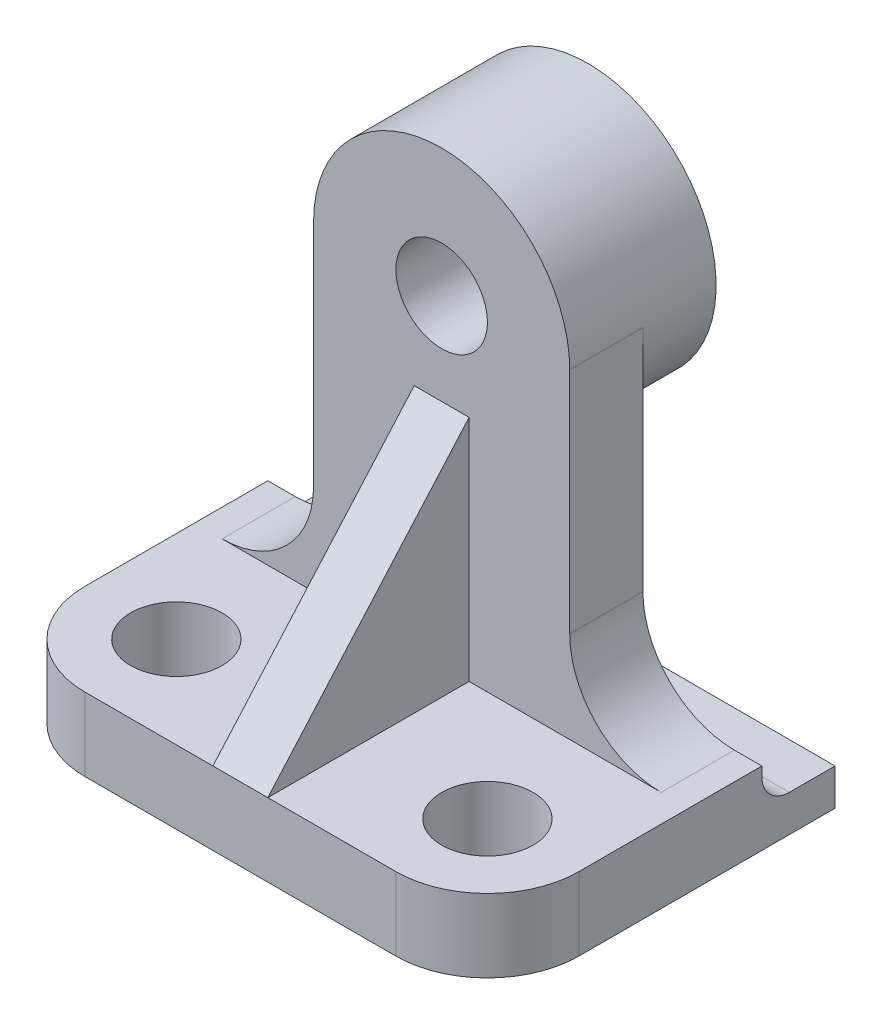
ISO-10303-21;
HEADER;
FILE_DESCRIPTION(('STEP AP214'),'2;1');
FILE_NAME('part.step','',(''),(''),'','','');
FILE_SCHEMA(('AUTOMOTIVE_DESIGN { 1 0 10303 214 1 1 1 1 }'));
ENDSEC;
DATA;
#1=APPLICATION_CONTEXT('core data for automotive mechanical design processes');
#2=APPLICATION_PROTOCOL_DEFINITION('international standard','automotive_design',2000,#1);
#3=PRODUCT_CONTEXT('',#1,'mechanical');
#4=PRODUCT('Part','Part','',(#3));
#5=PRODUCT_RELATED_PRODUCT_CATEGORY('part','',(#4));
#6=PRODUCT_DEFINITION_FORMATION('','',#4);
#7=PRODUCT_DEFINITION_CONTEXT('part definition',#1,'design');
#8=PRODUCT_DEFINITION('design','',#6,#7);
#9=PRODUCT_DEFINITION_SHAPE('','',#8);
#10=(LENGTH_UNIT() NAMED_UNIT(*) SI_UNIT(.MILLI.,.METRE.));
#11=(NAMED_UNIT(*) PLANE_ANGLE_UNIT() SI_UNIT($,.RADIAN.));
#12=(NAMED_UNIT(*) SI_UNIT($,.STERADIAN.) SOLID_ANGLE_UNIT());
#13=UNCERTAINTY_MEASURE_WITH_UNIT(LENGTH_MEASURE(1.E-05),#10,'distance_accuracy_value','');
#14=(GEOMETRIC_REPRESENTATION_CONTEXT(3) GLOBAL_UNCERTAINTY_ASSIGNED_CONTEXT((#13)) GLOBAL_UNIT_ASSIGNED_CONTEXT((#10,
#11,#12)) REPRESENTATION_CONTEXT('',''));
#15=CARTESIAN_POINT('',(0.,0.,0.));
#16=DIRECTION('',(0.,0.,1.));
#17=DIRECTION('',(1.,0.,0.));
#18=AXIS2_PLACEMENT_3D('',#15,#16,#17);
#19=CARTESIAN_POINT('',(-54.,8.,0.));
#20=DIRECTION('',(0.,1.,0.));
#21=DIRECTION('',(0.,0.,1.));
#22=AXIS2_PLACEMENT_3D('',#19,#20,#21);
#23=PLANE('',#22);
#24=CARTESIAN_POINT('',(-44.,7.99999999999999,-10.));
#25=DIRECTION('',(0.,1.,0.));
#26=DIRECTION('',(0.,0.,1.));
#27=AXIS2_PLACEMENT_3D('',#24,#25,#26);
#28=CIRCLE('',#27,5.);
#29=CARTESIAN_POINT('',(-44.,8.,-5.));
#30=VERTEX_POINT('',#29);
#31=EDGE_CURVE('E261',#30,#30,#28,.T.);
#32=ORIENTED_EDGE('',*,*,#31,.F.);
#33=EDGE_LOOP('',(#32));
#34=FACE_BOUND('',#33,.T.);
#35=DIRECTION('',(1.,0.,0.));
#36=VECTOR('',#35,1.);
#37=CARTESIAN_POINT('',(-54.,8.,0.));
#38=LINE('',#37,#36);
#39=CARTESIAN_POINT('',(-44.,8.,0.));
#40=VERTEX_POINT('',#39);
#41=CARTESIAN_POINT('',(-30.,8.,0.));
#42=VERTEX_POINT('',#41);
#43=EDGE_CURVE('E191',#40,#42,#38,.T.);
#44=ORIENTED_EDGE('',*,*,#43,.T.);
#45=DIRECTION('',(0.,0.,-1.));
#46=VECTOR('',#45,1.);
#47=CARTESIAN_POINT('',(-30.,8.,0.));
#48=LINE('',#47,#46);
#49=CARTESIAN_POINT('',(-30.,7.99999999999999,-22.));
#50=VERTEX_POINT('',#49);
#51=EDGE_CURVE('E190',#42,#50,#48,.T.);
#52=ORIENTED_EDGE('',*,*,#51,.T.);
#53=DIRECTION('',(1.,0.,0.));
#54=VECTOR('',#53,1.);
#55=CARTESIAN_POINT('',(0.,7.99999999999999,-22.));
#56=LINE('',#55,#54);
#57=CARTESIAN_POINT('',(-51.,7.99999999999999,-22.));
#58=VERTEX_POINT('',#57);
#59=EDGE_CURVE('E173',#58,#50,#56,.T.);
#60=ORIENTED_EDGE('',*,*,#59,.F.);
#61=DIRECTION('',(0.,0.,-1.));
#62=VECTOR('',#61,1.);
#63=CARTESIAN_POINT('',(-51.,8.,0.));
#64=LINE('',#63,#62);
#65=CARTESIAN_POINT('',(-51.,7.99999999999999,-30.));
#66=VERTEX_POINT('',#65);
#67=EDGE_CURVE('E373',#58,#66,#64,.T.);
#68=ORIENTED_EDGE('',*,*,#67,.T.);
#69=DIRECTION('',(1.,0.,0.));
#70=VECTOR('',#69,1.);
#71=CARTESIAN_POINT('',(-54.,7.99999999999999,-30.));
#72=LINE('',#71,#70);
#73=CARTESIAN_POINT('',(-54.,7.99999999999999,-30.));
#74=VERTEX_POINT('',#73);
#75=EDGE_CURVE('E323',#74,#66,#72,.T.);
#76=ORIENTED_EDGE('',*,*,#75,.F.);
#77=DIRECTION('',(0.,0.,1.));
#78=VECTOR('',#77,1.);
#79=CARTESIAN_POINT('',(-54.,8.,0.));
#80=LINE('',#79,#78);
#81=CARTESIAN_POINT('',(-54.,7.99999999999999,-10.));
#82=VERTEX_POINT('',#81);
#83=EDGE_CURVE('E292',#74,#82,#80,.T.);
#84=ORIENTED_EDGE('',*,*,#83,.T.);
#85=CARTESIAN_POINT('',(-44.,7.99999999999999,-10.));
#86=DIRECTION('',(0.,1.,0.));
#87=DIRECTION('',(0.,0.,1.));
#88=AXIS2_PLACEMENT_3D('',#85,#86,#87);
#89=CIRCLE('',#88,10.);
#90=EDGE_CURVE('E362',#82,#40,#89,.T.);
#91=ORIENTED_EDGE('',*,*,#90,.T.);
#92=EDGE_LOOP('',(#44,#52,#60,#68,#76,#84,#91));
#93=FACE_BOUND('',#92,.T.);
#94=ADVANCED_FACE('F47',(#34,#93),#23,.T.);
#95=CARTESIAN_POINT('',(-54.,7.99999999999999,-30.));
#96=DIRECTION('',(0.,0.,-1.));
#97=DIRECTION('',(-1.,0.,0.));
#98=AXIS2_PLACEMENT_3D('',#95,#96,#97);
#99=PLANE('',#98);
#100=DIRECTION('',(0.,1.,0.));
#101=VECTOR('',#100,1.);
#102=CARTESIAN_POINT('',(0.,7.99999999999999,-30.));
#103=LINE('',#102,#101);
#104=CARTESIAN_POINT('',(0.,7.00000000000001,-30.));
#105=VERTEX_POINT('',#104);
#106=CARTESIAN_POINT('',(0.,7.99999999999999,-30.));
#107=VERTEX_POINT('',#106);
#108=EDGE_CURVE('E312',#105,#107,#103,.T.);
#109=ORIENTED_EDGE('',*,*,#108,.F.);
#110=DIRECTION('',(1.,0.,0.));
#111=VECTOR('',#110,1.);
#112=CARTESIAN_POINT('',(-54.,7.00000000000001,-30.));
#113=LINE('',#112,#111);
#114=CARTESIAN_POINT('',(-54.,7.00000000000001,-30.));
#115=VERTEX_POINT('',#114);
#116=EDGE_CURVE('E328',#115,#105,#113,.T.);
#117=ORIENTED_EDGE('',*,*,#116,.F.);
#118=DIRECTION('',(0.,1.,0.));
#119=VECTOR('',#118,1.);
#120=CARTESIAN_POINT('',(-54.,7.99999999999999,-30.));
#121=LINE('',#120,#119);
#122=EDGE_CURVE('E288',#115,#74,#121,.T.);
#123=ORIENTED_EDGE('',*,*,#122,.T.);
#124=ORIENTED_EDGE('',*,*,#75,.T.);
#125=CARTESIAN_POINT('',(-51.,18.,-30.));
#126=DIRECTION('',(0.,0.,-1.));
#127=DIRECTION('',(-1.,0.,0.));
#128=AXIS2_PLACEMENT_3D('',#125,#126,#127);
#129=CIRCLE('',#128,10.);
#130=CARTESIAN_POINT('',(-41.,18.,-30.));
#131=VERTEX_POINT('',#130);
#132=EDGE_CURVE('E383',#66,#131,#129,.F.);
#133=ORIENTED_EDGE('',*,*,#132,.T.);
#134=DIRECTION('',(0.,-1.,0.));
#135=VECTOR('',#134,1.);
#136=CARTESIAN_POINT('',(-41.,0.,-30.));
#137=LINE('',#136,#135);
#138=CARTESIAN_POINT('',(-41.,43.,-30.));
#139=VERTEX_POINT('',#138);
#140=EDGE_CURVE('E235',#139,#131,#137,.T.);
#141=ORIENTED_EDGE('',*,*,#140,.F.);
#142=CARTESIAN_POINT('',(-27.,43.,-30.));
#143=DIRECTION('',(0.,0.,-1.));
#144=DIRECTION('',(-1.,0.,0.));
#145=AXIS2_PLACEMENT_3D('',#142,#143,#144);
#146=CIRCLE('',#145,14.);
#147=CARTESIAN_POINT('',(-13.,43.,-30.));
#148=VERTEX_POINT('',#147);
#149=EDGE_CURVE('E222',#148,#139,#146,.T.);
#150=ORIENTED_EDGE('',*,*,#149,.F.);
#151=DIRECTION('',(0.,-1.,0.));
#152=VECTOR('',#151,1.);
#153=CARTESIAN_POINT('',(-13.,0.,-30.));
#154=LINE('',#153,#152);
#155=CARTESIAN_POINT('',(-13.,18.,-30.));
#156=VERTEX_POINT('',#155);
#157=EDGE_CURVE('E227',#148,#156,#154,.T.);
#158=ORIENTED_EDGE('',*,*,#157,.T.);
#159=CARTESIAN_POINT('',(-3.,18.,-30.));
#160=DIRECTION('',(0.,0.,-1.));
#161=DIRECTION('',(-1.,0.,0.));
#162=AXIS2_PLACEMENT_3D('',#159,#160,#161);
#163=CIRCLE('',#162,10.);
#164=CARTESIAN_POINT('',(-3.,7.99999999999999,-30.));
#165=VERTEX_POINT('',#164);
#166=EDGE_CURVE('E56',#156,#165,#163,.F.);
#167=ORIENTED_EDGE('',*,*,#166,.T.);
#168=EDGE_CURVE('E327',#165,#107,#72,.T.);
#169=ORIENTED_EDGE('',*,*,#168,.T.);
#170=EDGE_LOOP('',(#109,#117,#123,#124,#133,#141,#150,#158,#167,#169));
#171=FACE_BOUND('',#170,.T.);
#172=ADVANCED_FACE('F391',(#171),#99,.T.);
#173=CARTESIAN_POINT('',(-54.,0.,0.));
#174=DIRECTION('',(0.,0.,1.));
#175=DIRECTION('',(1.,0.,0.));
#176=AXIS2_PLACEMENT_3D('',#173,#174,#175);
#177=PLANE('',#176);
#178=CARTESIAN_POINT('',(-24.,8.,0.));
#179=VERTEX_POINT('',#178);
#180=CARTESIAN_POINT('',(-10.,8.,0.));
#181=VERTEX_POINT('',#180);
#182=EDGE_CURVE('E322',#179,#181,#38,.T.);
#183=ORIENTED_EDGE('',*,*,#182,.F.);
#184=DIRECTION('',(-1.,0.,0.));
#185=VECTOR('',#184,1.);
#186=CARTESIAN_POINT('',(-54.,8.,0.));
#187=LINE('',#186,#185);
#188=EDGE_CURVE('E70',#42,#179,#187,.F.);
#189=ORIENTED_EDGE('',*,*,#188,.F.);
#190=ORIENTED_EDGE('',*,*,#43,.F.);
#191=DIRECTION('',(0.,-1.,0.));
#192=VECTOR('',#191,1.);
#193=CARTESIAN_POINT('',(-44.,0.,0.));
#194=LINE('',#193,#192);
#195=CARTESIAN_POINT('',(-44.,0.,0.));
#196=VERTEX_POINT('',#195);
#197=EDGE_CURVE('E345',#40,#196,#194,.T.);
#198=ORIENTED_EDGE('',*,*,#197,.T.);
#199=DIRECTION('',(1.,0.,0.));
#200=VECTOR('',#199,1.);
#201=CARTESIAN_POINT('',(-54.,0.,0.));
#202=LINE('',#201,#200);
#203=CARTESIAN_POINT('',(-10.,0.,0.));
#204=VERTEX_POINT('',#203);
#205=EDGE_CURVE('E296',#196,#204,#202,.T.);
#206=ORIENTED_EDGE('',*,*,#205,.T.);
#207=DIRECTION('',(0.,-1.,0.));
#208=VECTOR('',#207,1.);
#209=CARTESIAN_POINT('',(-10.,0.,0.));
#210=LINE('',#209,#208);
#211=EDGE_CURVE('E321',#204,#181,#210,.F.);
#212=ORIENTED_EDGE('',*,*,#211,.T.);
#213=EDGE_LOOP('',(#183,#189,#190,#198,#206,#212));
#214=FACE_BOUND('',#213,.T.);
#215=ADVANCED_FACE('F427',(#214),#177,.T.);
#216=DIRECTION('',(0.,0.,-1.));
#217=VECTOR('',#216,1.);
#218=CARTESIAN_POINT('',(-24.,8.,0.));
#219=LINE('',#218,#217);
#220=CARTESIAN_POINT('',(-24.,7.99999999999999,-22.));
#221=VERTEX_POINT('',#220);
#222=EDGE_CURVE('E63',#179,#221,#219,.T.);
#223=ORIENTED_EDGE('',*,*,#222,.F.);
#224=ORIENTED_EDGE('',*,*,#182,.T.);
#225=CARTESIAN_POINT('',(-10.,7.99999999999999,-10.));
#226=DIRECTION('',(0.,1.,0.));
#227=DIRECTION('',(0.,0.,1.));
#228=AXIS2_PLACEMENT_3D('',#225,#226,#227);
#229=CIRCLE('',#228,10.);
#230=CARTESIAN_POINT('',(0.,7.99999999999999,-10.));
#231=VERTEX_POINT('',#230);
#232=EDGE_CURVE('E359',#181,#231,#229,.T.);
#233=ORIENTED_EDGE('',*,*,#232,.T.);
#234=DIRECTION('',(0.,0.,1.));
#235=VECTOR('',#234,1.);
#236=CARTESIAN_POINT('',(0.,8.,0.));
#237=LINE('',#236,#235);
#238=EDGE_CURVE('E276',#107,#231,#237,.T.);
#239=ORIENTED_EDGE('',*,*,#238,.F.);
#240=ORIENTED_EDGE('',*,*,#168,.F.);
#241=DIRECTION('',(0.,0.,-1.));
#242=VECTOR('',#241,1.);
#243=CARTESIAN_POINT('',(-3.,7.99999999999999,-22.));
#244=LINE('',#243,#242);
#245=CARTESIAN_POINT('',(-3.,7.99999999999999,-22.));
#246=VERTEX_POINT('',#245);
#247=EDGE_CURVE('E369',#165,#246,#244,.F.);
#248=ORIENTED_EDGE('',*,*,#247,.T.);
#249=EDGE_CURVE('E187',#221,#246,#56,.T.);
#250=ORIENTED_EDGE('',*,*,#249,.F.);
#251=EDGE_LOOP('',(#223,#224,#233,#239,#240,#248,#250));
#252=FACE_BOUND('',#251,.T.);
#253=CARTESIAN_POINT('',(-10.,7.99999999999999,-10.));
#254=DIRECTION('',(0.,1.,0.));
#255=DIRECTION('',(0.,0.,1.));
#256=AXIS2_PLACEMENT_3D('',#253,#254,#255);
#257=CIRCLE('',#256,5.);
#258=CARTESIAN_POINT('',(-10.,8.,-5.00000000000001));
#259=VERTEX_POINT('',#258);
#260=EDGE_CURVE('E265',#259,#259,#257,.T.);
#261=ORIENTED_EDGE('',*,*,#260,.F.);
#262=EDGE_LOOP('',(#261));
#263=FACE_BOUND('',#262,.T.);
#264=ADVANCED_FACE('F397',(#252,#263),#23,.T.);
#265=CARTESIAN_POINT('',(-54.,6.99999999999999,-33.));
#266=DIRECTION('',(1.,0.,0.));
#267=DIRECTION('',(0.,0.,-1.));
#268=AXIS2_PLACEMENT_3D('',#265,#266,#267);
#269=CYLINDRICAL_SURFACE('',#268,3.);
#270=CARTESIAN_POINT('',(0.,6.99999999999999,-33.));
#271=DIRECTION('',(-1.,0.,0.));
#272=DIRECTION('',(0.,0.,-1.));
#273=AXIS2_PLACEMENT_3D('',#270,#271,#272);
#274=CIRCLE('',#273,3.);
#275=CARTESIAN_POINT('',(0.,3.99999999999999,-33.));
#276=VERTEX_POINT('',#275);
#277=EDGE_CURVE('E308',#276,#105,#274,.T.);
#278=ORIENTED_EDGE('',*,*,#277,.F.);
#279=DIRECTION('',(1.,0.,0.));
#280=VECTOR('',#279,1.);
#281=CARTESIAN_POINT('',(-54.,3.99999999999999,-33.));
#282=LINE('',#281,#280);
#283=CARTESIAN_POINT('',(-54.,3.99999999999999,-33.));
#284=VERTEX_POINT('',#283);
#285=EDGE_CURVE('E331',#284,#276,#282,.T.);
#286=ORIENTED_EDGE('',*,*,#285,.F.);
#287=CARTESIAN_POINT('',(-54.,6.99999999999999,-33.));
#288=DIRECTION('',(-1.,0.,0.));
#289=DIRECTION('',(0.,0.,-1.));
#290=AXIS2_PLACEMENT_3D('',#287,#288,#289);
#291=CIRCLE('',#290,3.);
#292=EDGE_CURVE('E284',#284,#115,#291,.T.);
#293=ORIENTED_EDGE('',*,*,#292,.T.);
#294=ORIENTED_EDGE('',*,*,#116,.T.);
#295=EDGE_LOOP('',(#278,#286,#293,#294));
#296=FACE_BOUND('',#295,.T.);
#297=ADVANCED_FACE('F469',(#296),#269,.F.);
#298=CARTESIAN_POINT('',(-54.,3.99999999999999,-33.));
#299=DIRECTION('',(0.,1.,0.));
#300=DIRECTION('',(0.,0.,1.));
#301=AXIS2_PLACEMENT_3D('',#298,#299,#300);
#302=PLANE('',#301);
#303=DIRECTION('',(0.,0.,1.));
#304=VECTOR('',#303,1.);
#305=CARTESIAN_POINT('',(0.,3.99999999999999,-33.));
#306=LINE('',#305,#304);
#307=CARTESIAN_POINT('',(0.,4.,-38.));
#308=VERTEX_POINT('',#307);
#309=EDGE_CURVE('E304',#308,#276,#306,.T.);
#310=ORIENTED_EDGE('',*,*,#309,.F.);
#311=DIRECTION('',(1.,0.,0.));
#312=VECTOR('',#311,1.);
#313=CARTESIAN_POINT('',(-54.,4.,-38.));
#314=LINE('',#313,#312);
#315=CARTESIAN_POINT('',(-54.,4.,-38.));
#316=VERTEX_POINT('',#315);
#317=EDGE_CURVE('E334',#316,#308,#314,.T.);
#318=ORIENTED_EDGE('',*,*,#317,.F.);
#319=DIRECTION('',(0.,0.,1.));
#320=VECTOR('',#319,1.);
#321=CARTESIAN_POINT('',(-54.,3.99999999999999,-33.));
#322=LINE('',#321,#320);
#323=EDGE_CURVE('E280',#316,#284,#322,.T.);
#324=ORIENTED_EDGE('',*,*,#323,.T.);
#325=ORIENTED_EDGE('',*,*,#285,.T.);
#326=EDGE_LOOP('',(#310,#318,#324,#325));
#327=FACE_BOUND('',#326,.T.);
#328=ADVANCED_FACE('F474',(#327),#302,.T.);
#329=CARTESIAN_POINT('',(-54.,0.,-38.));
#330=DIRECTION('',(0.,0.,-1.));
#331=DIRECTION('',(-1.,0.,0.));
#332=AXIS2_PLACEMENT_3D('',#329,#330,#331);
#333=PLANE('',#332);
#334=DIRECTION('',(0.,1.,0.));
#335=VECTOR('',#334,1.);
#336=CARTESIAN_POINT('',(0.,0.,-38.));
#337=LINE('',#336,#335);
#338=CARTESIAN_POINT('',(0.,0.,-38.));
#339=VERTEX_POINT('',#338);
#340=EDGE_CURVE('E300',#339,#308,#337,.T.);
#341=ORIENTED_EDGE('',*,*,#340,.F.);
#342=DIRECTION('',(1.,0.,0.));
#343=VECTOR('',#342,1.);
#344=CARTESIAN_POINT('',(-54.,0.,-38.));
#345=LINE('',#344,#343);
#346=CARTESIAN_POINT('',(-54.,0.,-38.));
#347=VERTEX_POINT('',#346);
#348=EDGE_CURVE('E337',#347,#339,#345,.T.);
#349=ORIENTED_EDGE('',*,*,#348,.F.);
#350=DIRECTION('',(0.,1.,0.));
#351=VECTOR('',#350,1.);
#352=CARTESIAN_POINT('',(-54.,0.,-38.));
#353=LINE('',#352,#351);
#354=EDGE_CURVE('E275',#347,#316,#353,.T.);
#355=ORIENTED_EDGE('',*,*,#354,.T.);
#356=ORIENTED_EDGE('',*,*,#317,.T.);
#357=EDGE_LOOP('',(#341,#349,#355,#356));
#358=FACE_BOUND('',#357,.T.);
#359=ADVANCED_FACE('F526',(#358),#333,.T.);
#360=CARTESIAN_POINT('',(-54.,0.,0.));
#361=DIRECTION('',(0.,-1.,0.));
#362=DIRECTION('',(0.,0.,-1.));
#363=AXIS2_PLACEMENT_3D('',#360,#361,#362);
#364=PLANE('',#363);
#365=CARTESIAN_POINT('',(-10.,0.,-10.));
#366=DIRECTION('',(0.,-1.,0.));
#367=DIRECTION('',(0.,0.,-1.));
#368=AXIS2_PLACEMENT_3D('',#365,#366,#367);
#369=CIRCLE('',#368,10.);
#370=CARTESIAN_POINT('',(0.,0.,-10.));
#371=VERTEX_POINT('',#370);
#372=EDGE_CURVE('E349',#371,#204,#369,.T.);
#373=ORIENTED_EDGE('',*,*,#372,.T.);
#374=ORIENTED_EDGE('',*,*,#205,.F.);
#375=CARTESIAN_POINT('',(-44.,0.,-10.));
#376=DIRECTION('',(0.,-1.,0.));
#377=DIRECTION('',(0.,0.,-1.));
#378=AXIS2_PLACEMENT_3D('',#375,#376,#377);
#379=CIRCLE('',#378,10.);
#380=CARTESIAN_POINT('',(-54.,0.,-10.));
#381=VERTEX_POINT('',#380);
#382=EDGE_CURVE('E353',#196,#381,#379,.T.);
#383=ORIENTED_EDGE('',*,*,#382,.T.);
#384=DIRECTION('',(0.,0.,-1.));
#385=VECTOR('',#384,1.);
#386=CARTESIAN_POINT('',(-54.,0.,0.));
#387=LINE('',#386,#385);
#388=EDGE_CURVE('E272',#381,#347,#387,.T.);
#389=ORIENTED_EDGE('',*,*,#388,.T.);
#390=ORIENTED_EDGE('',*,*,#348,.T.);
#391=DIRECTION('',(0.,0.,-1.));
#392=VECTOR('',#391,1.);
#393=CARTESIAN_POINT('',(0.,0.,0.));
#394=LINE('',#393,#392);
#395=EDGE_CURVE('E260',#371,#339,#394,.T.);
#396=ORIENTED_EDGE('',*,*,#395,.F.);
#397=EDGE_LOOP('',(#373,#374,#383,#389,#390,#396));
#398=FACE_BOUND('',#397,.T.);
#399=CARTESIAN_POINT('',(-10.,0.,-10.));
#400=DIRECTION('',(0.,1.,0.));
#401=DIRECTION('',(0.,0.,1.));
#402=AXIS2_PLACEMENT_3D('',#399,#400,#401);
#403=CIRCLE('',#402,5.);
#404=CARTESIAN_POINT('',(-10.,0.,-5.));
#405=VERTEX_POINT('',#404);
#406=EDGE_CURVE('E252',#405,#405,#403,.T.);
#407=ORIENTED_EDGE('',*,*,#406,.T.);
#408=EDGE_LOOP('',(#407));
#409=FACE_BOUND('',#408,.T.);
#410=CARTESIAN_POINT('',(-44.,0.,-10.));
#411=DIRECTION('',(0.,1.,0.));
#412=DIRECTION('',(0.,0.,1.));
#413=AXIS2_PLACEMENT_3D('',#410,#411,#412);
#414=CIRCLE('',#413,5.);
#415=CARTESIAN_POINT('',(-44.,0.,-5.));
#416=VERTEX_POINT('',#415);
#417=EDGE_CURVE('E256',#416,#416,#414,.T.);
#418=ORIENTED_EDGE('',*,*,#417,.T.);
#419=EDGE_LOOP('',(#418));
#420=FACE_BOUND('',#419,.T.);
#421=ADVANCED_FACE('F429',(#398,#409,#420),#364,.T.);
#422=CARTESIAN_POINT('',(-54.,6.99999999999999,-33.));
#423=DIRECTION('',(1.,0.,0.));
#424=DIRECTION('',(0.,0.,-1.));
#425=AXIS2_PLACEMENT_3D('',#422,#423,#424);
#426=PLANE('',#425);
#427=ORIENTED_EDGE('',*,*,#388,.F.);
#428=DIRECTION('',(0.,-1.,0.));
#429=VECTOR('',#428,1.);
#430=CARTESIAN_POINT('',(-54.,8.,-10.));
#431=LINE('',#430,#429);
#432=EDGE_CURVE('E356',#381,#82,#431,.F.);
#433=ORIENTED_EDGE('',*,*,#432,.T.);
#434=ORIENTED_EDGE('',*,*,#83,.F.);
#435=ORIENTED_EDGE('',*,*,#122,.F.);
#436=ORIENTED_EDGE('',*,*,#292,.F.);
#437=ORIENTED_EDGE('',*,*,#323,.F.);
#438=ORIENTED_EDGE('',*,*,#354,.F.);
#439=EDGE_LOOP('',(#427,#433,#434,#435,#436,#437,#438));
#440=FACE_BOUND('',#439,.T.);
#441=ADVANCED_FACE('F420',(#440),#426,.F.);
#442=CARTESIAN_POINT('',(0.,6.99999999999999,-33.));
#443=DIRECTION('',(1.,0.,0.));
#444=DIRECTION('',(0.,0.,-1.));
#445=AXIS2_PLACEMENT_3D('',#442,#443,#444);
#446=PLANE('',#445);
#447=ORIENTED_EDGE('',*,*,#238,.T.);
#448=DIRECTION('',(0.,-1.,0.));
#449=VECTOR('',#448,1.);
#450=CARTESIAN_POINT('',(0.,6.99999999999999,-10.));
#451=LINE('',#450,#449);
#452=EDGE_CURVE('E365',#231,#371,#451,.T.);
#453=ORIENTED_EDGE('',*,*,#452,.T.);
#454=ORIENTED_EDGE('',*,*,#395,.T.);
#455=ORIENTED_EDGE('',*,*,#340,.T.);
#456=ORIENTED_EDGE('',*,*,#309,.T.);
#457=ORIENTED_EDGE('',*,*,#277,.T.);
#458=ORIENTED_EDGE('',*,*,#108,.T.);
#459=EDGE_LOOP('',(#447,#453,#454,#455,#456,#457,#458));
#460=FACE_BOUND('',#459,.T.);
#461=ADVANCED_FACE('F485',(#460),#446,.T.);
#462=CARTESIAN_POINT('',(-44.,0.,-10.));
#463=DIRECTION('',(0.,1.,0.));
#464=DIRECTION('',(0.,0.,1.));
#465=AXIS2_PLACEMENT_3D('',#462,#463,#464);
#466=CYLINDRICAL_SURFACE('',#465,10.);
#467=ORIENTED_EDGE('',*,*,#90,.F.);
#468=ORIENTED_EDGE('',*,*,#432,.F.);
#469=ORIENTED_EDGE('',*,*,#382,.F.);
#470=ORIENTED_EDGE('',*,*,#197,.F.);
#471=EDGE_LOOP('',(#467,#468,#469,#470));
#472=FACE_BOUND('',#471,.T.);
#473=ADVANCED_FACE('F425',(#472),#466,.T.);
#474=CARTESIAN_POINT('',(-10.,6.99999999999999,-10.));
#475=DIRECTION('',(0.,-1.,0.));
#476=DIRECTION('',(0.,0.,-1.));
#477=AXIS2_PLACEMENT_3D('',#474,#475,#476);
#478=CYLINDRICAL_SURFACE('',#477,10.);
#479=ORIENTED_EDGE('',*,*,#232,.F.);
#480=ORIENTED_EDGE('',*,*,#211,.F.);
#481=ORIENTED_EDGE('',*,*,#372,.F.);
#482=ORIENTED_EDGE('',*,*,#452,.F.);
#483=EDGE_LOOP('',(#479,#480,#481,#482));
#484=FACE_BOUND('',#483,.T.);
#485=ADVANCED_FACE('F436',(#484),#478,.T.);
#486=CARTESIAN_POINT('',(-10.,0.,-10.));
#487=DIRECTION('',(0.,1.,0.));
#488=DIRECTION('',(0.,0.,1.));
#489=AXIS2_PLACEMENT_3D('',#486,#487,#488);
#490=CYLINDRICAL_SURFACE('',#489,5.);
#491=ORIENTED_EDGE('',*,*,#406,.F.);
#492=EDGE_LOOP('',(#491));
#493=FACE_BOUND('',#492,.T.);
#494=ORIENTED_EDGE('',*,*,#260,.T.);
#495=EDGE_LOOP('',(#494));
#496=FACE_BOUND('',#495,.T.);
#497=ADVANCED_FACE('F487',(#493,#496),#490,.F.);
#498=CARTESIAN_POINT('',(-44.,0.,-10.));
#499=DIRECTION('',(0.,1.,0.));
#500=DIRECTION('',(0.,0.,1.));
#501=AXIS2_PLACEMENT_3D('',#498,#499,#500);
#502=CYLINDRICAL_SURFACE('',#501,5.);
#503=ORIENTED_EDGE('',*,*,#417,.F.);
#504=EDGE_LOOP('',(#503));
#505=FACE_BOUND('',#504,.T.);
#506=ORIENTED_EDGE('',*,*,#31,.T.);
#507=EDGE_LOOP('',(#506));
#508=FACE_BOUND('',#507,.T.);
#509=ADVANCED_FACE('F507',(#505,#508),#502,.F.);
#510=CARTESIAN_POINT('',(-27.,43.,-22.));
#511=DIRECTION('',(0.,0.,-1.));
#512=DIRECTION('',(-1.,0.,0.));
#513=AXIS2_PLACEMENT_3D('',#510,#511,#512);
#514=CYLINDRICAL_SURFACE('',#513,14.);
#515=ORIENTED_EDGE('',*,*,#149,.T.);
#516=DIRECTION('',(0.,0.,-1.));
#517=VECTOR('',#516,1.);
#518=CARTESIAN_POINT('',(-41.,43.,-22.));
#519=LINE('',#518,#517);
#520=CARTESIAN_POINT('',(-41.,43.,-22.));
#521=VERTEX_POINT('',#520);
#522=EDGE_CURVE('E248',#521,#139,#519,.T.);
#523=ORIENTED_EDGE('',*,*,#522,.F.);
#524=CARTESIAN_POINT('',(-27.,43.,-22.));
#525=DIRECTION('',(0.,0.,-1.));
#526=DIRECTION('',(-1.,0.,0.));
#527=AXIS2_PLACEMENT_3D('',#524,#525,#526);
#528=CIRCLE('',#527,14.);
#529=CARTESIAN_POINT('',(-13.,43.,-22.));
#530=VERTEX_POINT('',#529);
#531=EDGE_CURVE('E230',#521,#530,#528,.T.);
#532=ORIENTED_EDGE('',*,*,#531,.T.);
#533=DIRECTION('',(0.,0.,-1.));
#534=VECTOR('',#533,1.);
#535=CARTESIAN_POINT('',(-13.,43.,-22.));
#536=LINE('',#535,#534);
#537=EDGE_CURVE('E241',#530,#148,#536,.T.);
#538=ORIENTED_EDGE('',*,*,#537,.T.);
#539=EDGE_LOOP('',(#515,#523,#532,#538));
#540=FACE_BOUND('',#539,.T.);
#541=CARTESIAN_POINT('',(-27.,43.,-38.));
#542=DIRECTION('',(0.,0.,-1.));
#543=DIRECTION('',(-1.,0.,0.));
#544=AXIS2_PLACEMENT_3D('',#541,#542,#543);
#545=CIRCLE('',#544,14.);
#546=CARTESIAN_POINT('',(-41.,43.,-38.));
#547=VERTEX_POINT('',#546);
#548=EDGE_CURVE('E223',#547,#547,#545,.T.);
#549=ORIENTED_EDGE('',*,*,#548,.F.);
#550=EDGE_LOOP('',(#549));
#551=FACE_BOUND('',#550,.T.);
#552=ADVANCED_FACE('F406',(#540,#551),#514,.T.);
#553=CARTESIAN_POINT('',(-41.,0.,-22.));
#554=DIRECTION('',(1.,0.,0.));
#555=DIRECTION('',(0.,0.,-1.));
#556=AXIS2_PLACEMENT_3D('',#553,#554,#555);
#557=PLANE('',#556);
#558=ORIENTED_EDGE('',*,*,#140,.T.);
#559=DIRECTION('',(0.,0.,-1.));
#560=VECTOR('',#559,1.);
#561=CARTESIAN_POINT('',(-41.,18.,-22.));
#562=LINE('',#561,#560);
#563=CARTESIAN_POINT('',(-41.,18.,-22.));
#564=VERTEX_POINT('',#563);
#565=EDGE_CURVE('E376',#131,#564,#562,.F.);
#566=ORIENTED_EDGE('',*,*,#565,.T.);
#567=DIRECTION('',(0.,-1.,0.));
#568=VECTOR('',#567,1.);
#569=CARTESIAN_POINT('',(-41.,0.,-22.));
#570=LINE('',#569,#568);
#571=EDGE_CURVE('E186',#521,#564,#570,.T.);
#572=ORIENTED_EDGE('',*,*,#571,.F.);
#573=ORIENTED_EDGE('',*,*,#522,.T.);
#574=EDGE_LOOP('',(#558,#566,#572,#573));
#575=FACE_BOUND('',#574,.T.);
#576=ADVANCED_FACE('F411',(#575),#557,.F.);
#577=CARTESIAN_POINT('',(-13.,0.,-22.));
#578=DIRECTION('',(1.,0.,0.));
#579=DIRECTION('',(0.,0.,-1.));
#580=AXIS2_PLACEMENT_3D('',#577,#578,#579);
#581=PLANE('',#580);
#582=DIRECTION('',(0.,-1.,0.));
#583=VECTOR('',#582,1.);
#584=CARTESIAN_POINT('',(-13.,0.,-22.));
#585=LINE('',#584,#583);
#586=CARTESIAN_POINT('',(-13.,18.,-22.));
#587=VERTEX_POINT('',#586);
#588=EDGE_CURVE('E234',#530,#587,#585,.T.);
#589=ORIENTED_EDGE('',*,*,#588,.T.);
#590=DIRECTION('',(0.,0.,-1.));
#591=VECTOR('',#590,1.);
#592=CARTESIAN_POINT('',(-13.,18.,-30.));
#593=LINE('',#592,#591);
#594=EDGE_CURVE('E379',#587,#156,#593,.T.);
#595=ORIENTED_EDGE('',*,*,#594,.T.);
#596=ORIENTED_EDGE('',*,*,#157,.F.);
#597=ORIENTED_EDGE('',*,*,#537,.F.);
#598=EDGE_LOOP('',(#589,#595,#596,#597));
#599=FACE_BOUND('',#598,.T.);
#600=ADVANCED_FACE('F404',(#599),#581,.T.);
#601=CARTESIAN_POINT('',(0.,0.,-22.));
#602=DIRECTION('',(0.,0.,-1.));
#603=DIRECTION('',(-1.,0.,0.));
#604=AXIS2_PLACEMENT_3D('',#601,#602,#603);
#605=PLANE('',#604);
#606=CARTESIAN_POINT('',(-27.,43.,-22.));
#607=DIRECTION('',(0.,0.,-1.));
#608=DIRECTION('',(-1.,0.,0.));
#609=AXIS2_PLACEMENT_3D('',#606,#607,#608);
#610=CIRCLE('',#609,5.);
#611=CARTESIAN_POINT('',(-32.,43.,-22.));
#612=VERTEX_POINT('',#611);
#613=EDGE_CURVE('E218',#612,#612,#610,.T.);
#614=ORIENTED_EDGE('',*,*,#613,.T.);
#615=EDGE_LOOP('',(#614));
#616=FACE_BOUND('',#615,.T.);
#617=DIRECTION('',(-1.,0.,0.));
#618=VECTOR('',#617,1.);
#619=CARTESIAN_POINT('',(0.,33.,-22.));
#620=LINE('',#619,#618);
#621=CARTESIAN_POINT('',(-30.,33.,-22.));
#622=VERTEX_POINT('',#621);
#623=CARTESIAN_POINT('',(-24.,33.,-22.));
#624=VERTEX_POINT('',#623);
#625=EDGE_CURVE('E209',#622,#624,#620,.F.);
#626=ORIENTED_EDGE('',*,*,#625,.T.);
#627=DIRECTION('',(0.,-1.,0.));
#628=VECTOR('',#627,1.);
#629=CARTESIAN_POINT('',(-24.,0.,-22.));
#630=LINE('',#629,#628);
#631=EDGE_CURVE('E203',#624,#221,#630,.T.);
#632=ORIENTED_EDGE('',*,*,#631,.T.);
#633=ORIENTED_EDGE('',*,*,#249,.T.);
#634=CARTESIAN_POINT('',(-3.,18.,-22.));
#635=DIRECTION('',(0.,0.,-1.));
#636=DIRECTION('',(-1.,0.,0.));
#637=AXIS2_PLACEMENT_3D('',#634,#635,#636);
#638=CIRCLE('',#637,10.);
#639=EDGE_CURVE('E11',#246,#587,#638,.T.);
#640=ORIENTED_EDGE('',*,*,#639,.T.);
#641=ORIENTED_EDGE('',*,*,#588,.F.);
#642=ORIENTED_EDGE('',*,*,#531,.F.);
#643=ORIENTED_EDGE('',*,*,#571,.T.);
#644=CARTESIAN_POINT('',(-51.,18.,-22.));
#645=DIRECTION('',(0.,0.,-1.));
#646=DIRECTION('',(-1.,0.,0.));
#647=AXIS2_PLACEMENT_3D('',#644,#645,#646);
#648=CIRCLE('',#647,10.);
#649=EDGE_CURVE('E181',#564,#58,#648,.T.);
#650=ORIENTED_EDGE('',*,*,#649,.T.);
#651=ORIENTED_EDGE('',*,*,#59,.T.);
#652=DIRECTION('',(0.,-1.,0.));
#653=VECTOR('',#652,1.);
#654=CARTESIAN_POINT('',(-30.,0.,-22.));
#655=LINE('',#654,#653);
#656=EDGE_CURVE('E177',#622,#50,#655,.T.);
#657=ORIENTED_EDGE('',*,*,#656,.F.);
#658=EDGE_LOOP('',(#626,#632,#633,#640,#641,#642,#643,#650,#651,#657));
#659=FACE_BOUND('',#658,.T.);
#660=ADVANCED_FACE('F175',(#616,#659),#605,.F.);
#661=CARTESIAN_POINT('',(-51.,18.,0.));
#662=DIRECTION('',(0.,0.,-1.));
#663=DIRECTION('',(0.,1.,0.));
#664=AXIS2_PLACEMENT_3D('',#661,#662,#663);
#665=CYLINDRICAL_SURFACE('',#664,10.);
#666=ORIENTED_EDGE('',*,*,#649,.F.);
#667=ORIENTED_EDGE('',*,*,#565,.F.);
#668=ORIENTED_EDGE('',*,*,#132,.F.);
#669=ORIENTED_EDGE('',*,*,#67,.F.);
#670=EDGE_LOOP('',(#666,#667,#668,#669));
#671=FACE_BOUND('',#670,.T.);
#672=ADVANCED_FACE('F414',(#671),#665,.F.);
#673=CARTESIAN_POINT('',(-3.,18.,-22.));
#674=DIRECTION('',(0.,0.,1.));
#675=DIRECTION('',(0.,-1.,0.));
#676=AXIS2_PLACEMENT_3D('',#673,#674,#675);
#677=CYLINDRICAL_SURFACE('',#676,10.);
#678=ORIENTED_EDGE('',*,*,#639,.F.);
#679=ORIENTED_EDGE('',*,*,#247,.F.);
#680=ORIENTED_EDGE('',*,*,#166,.F.);
#681=ORIENTED_EDGE('',*,*,#594,.F.);
#682=EDGE_LOOP('',(#678,#679,#680,#681));
#683=FACE_BOUND('',#682,.T.);
#684=ADVANCED_FACE('F49',(#683),#677,.F.);
#685=CARTESIAN_POINT('',(-27.,43.,-38.));
#686=DIRECTION('',(0.,0.,-1.));
#687=DIRECTION('',(-1.,0.,0.));
#688=AXIS2_PLACEMENT_3D('',#685,#686,#687);
#689=PLANE('',#688);
#690=CARTESIAN_POINT('',(-27.,43.,-38.));
#691=DIRECTION('',(0.,0.,-1.));
#692=DIRECTION('',(-1.,0.,0.));
#693=AXIS2_PLACEMENT_3D('',#690,#691,#692);
#694=CIRCLE('',#693,5.);
#695=CARTESIAN_POINT('',(-32.,43.,-38.));
#696=VERTEX_POINT('',#695);
#697=EDGE_CURVE('E214',#696,#696,#694,.T.);
#698=ORIENTED_EDGE('',*,*,#697,.F.);
#699=EDGE_LOOP('',(#698));
#700=FACE_BOUND('',#699,.T.);
#701=ORIENTED_EDGE('',*,*,#548,.T.);
#702=EDGE_LOOP('',(#701));
#703=FACE_BOUND('',#702,.T.);
#704=ADVANCED_FACE('F493',(#700,#703),#689,.T.);
#705=CARTESIAN_POINT('',(-27.,43.,0.));
#706=DIRECTION('',(0.,0.,-1.));
#707=DIRECTION('',(-1.,0.,0.));
#708=AXIS2_PLACEMENT_3D('',#705,#706,#707);
#709=CYLINDRICAL_SURFACE('',#708,5.);
#710=ORIENTED_EDGE('',*,*,#697,.T.);
#711=EDGE_LOOP('',(#710));
#712=FACE_BOUND('',#711,.T.);
#713=ORIENTED_EDGE('',*,*,#613,.F.);
#714=EDGE_LOOP('',(#713));
#715=FACE_BOUND('',#714,.T.);
#716=ADVANCED_FACE('F456',(#712,#715),#709,.F.);
#717=CARTESIAN_POINT('',(-27.,8.,0.));
#718=DIRECTION('',(0.,-0.660627894892025,-0.750713516922755));
#719=DIRECTION('',(0.,0.750713516922755,-0.660627894892025));
#720=AXIS2_PLACEMENT_3D('',#717,#718,#719);
#721=PLANE('',#720);
#722=DIRECTION('',(0.,0.750713516922755,-0.660627894892025));
#723=VECTOR('',#722,1.);
#724=CARTESIAN_POINT('',(-30.,8.,0.));
#725=LINE('',#724,#723);
#726=EDGE_CURVE('E199',#42,#622,#725,.T.);
#727=ORIENTED_EDGE('',*,*,#726,.F.);
#728=ORIENTED_EDGE('',*,*,#188,.T.);
#729=DIRECTION('',(0.,0.750713516922755,-0.660627894892025));
#730=VECTOR('',#729,1.);
#731=CARTESIAN_POINT('',(-24.,8.,0.));
#732=LINE('',#731,#730);
#733=EDGE_CURVE('E196',#179,#624,#732,.T.);
#734=ORIENTED_EDGE('',*,*,#733,.T.);
#735=ORIENTED_EDGE('',*,*,#625,.F.);
#736=EDGE_LOOP('',(#727,#728,#734,#735));
#737=FACE_BOUND('',#736,.T.);
#738=ADVANCED_FACE('F441',(#737),#721,.F.);
#739=CARTESIAN_POINT('',(-24.,28.5,-19.));
#740=DIRECTION('',(1.,0.,0.));
#741=DIRECTION('',(0.,0.,-1.));
#742=AXIS2_PLACEMENT_3D('',#739,#740,#741);
#743=PLANE('',#742);
#744=ORIENTED_EDGE('',*,*,#631,.F.);
#745=ORIENTED_EDGE('',*,*,#733,.F.);
#746=ORIENTED_EDGE('',*,*,#222,.T.);
#747=EDGE_LOOP('',(#744,#745,#746));
#748=FACE_BOUND('',#747,.T.);
#749=ADVANCED_FACE('F444',(#748),#743,.T.);
#750=CARTESIAN_POINT('',(-30.,28.5,-19.));
#751=DIRECTION('',(1.,0.,0.));
#752=DIRECTION('',(0.,0.,-1.));
#753=AXIS2_PLACEMENT_3D('',#750,#751,#752);
#754=PLANE('',#753);
#755=ORIENTED_EDGE('',*,*,#726,.T.);
#756=ORIENTED_EDGE('',*,*,#656,.T.);
#757=ORIENTED_EDGE('',*,*,#51,.F.);
#758=EDGE_LOOP('',(#755,#756,#757));
#759=FACE_BOUND('',#758,.T.);
#760=ADVANCED_FACE('F198',(#759),#754,.F.);
#761=CLOSED_SHELL('',(#94,#172,#215,#264,#297,#328,#359,#421,#441,#461,#473,#485,#497,#509,#552,
#576,#600,#660,#672,#684,#704,#716,#738,#749,#760));
#762=MANIFOLD_SOLID_BREP('B2',#761);
#763=ADVANCED_BREP_SHAPE_REPRESENTATION('',(#18,#762),#14);
#764=SHAPE_DEFINITION_REPRESENTATION(#9,#763);
ENDSEC;
END-ISO-10303-21;
